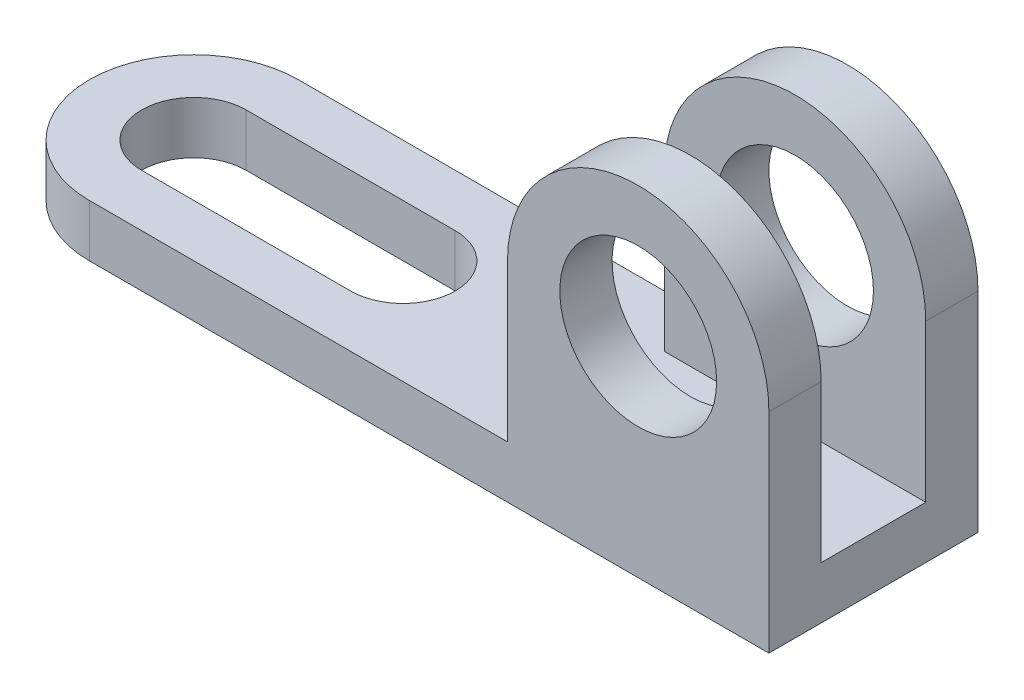
ISO-10303-21;
HEADER;
FILE_DESCRIPTION(('STEP AP214'),'2;1');
FILE_NAME('part.step','',(''),(''),'','','');
FILE_SCHEMA(('AUTOMOTIVE_DESIGN { 1 0 10303 214 1 1 1 1 }'));
ENDSEC;
DATA;
#1=APPLICATION_CONTEXT('core data for automotive mechanical design processes');
#2=APPLICATION_PROTOCOL_DEFINITION('international standard','automotive_design',2000,#1);
#3=PRODUCT_CONTEXT('',#1,'mechanical');
#4=PRODUCT('Part','Part','',(#3));
#5=PRODUCT_RELATED_PRODUCT_CATEGORY('part','',(#4));
#6=PRODUCT_DEFINITION_FORMATION('','',#4);
#7=PRODUCT_DEFINITION_CONTEXT('part definition',#1,'design');
#8=PRODUCT_DEFINITION('design','',#6,#7);
#9=PRODUCT_DEFINITION_SHAPE('','',#8);
#10=(LENGTH_UNIT() NAMED_UNIT(*) SI_UNIT(.MILLI.,.METRE.));
#11=(NAMED_UNIT(*) PLANE_ANGLE_UNIT() SI_UNIT($,.RADIAN.));
#12=(NAMED_UNIT(*) SI_UNIT($,.STERADIAN.) SOLID_ANGLE_UNIT());
#13=UNCERTAINTY_MEASURE_WITH_UNIT(LENGTH_MEASURE(1.E-05),#10,'distance_accuracy_value','');
#14=(GEOMETRIC_REPRESENTATION_CONTEXT(3) GLOBAL_UNCERTAINTY_ASSIGNED_CONTEXT((#13)) GLOBAL_UNIT_ASSIGNED_CONTEXT((#10,
#11,#12)) REPRESENTATION_CONTEXT('',''));
#15=CARTESIAN_POINT('',(0.,0.,0.));
#16=DIRECTION('',(0.,0.,1.));
#17=DIRECTION('',(1.,0.,0.));
#18=AXIS2_PLACEMENT_3D('',#15,#16,#17);
#19=CARTESIAN_POINT('',(65.,40.,-20.));
#20=DIRECTION('',(0.,0.,1.));
#21=DIRECTION('',(1.,0.,0.));
#22=AXIS2_PLACEMENT_3D('',#19,#20,#21);
#23=CYLINDRICAL_SURFACE('',#22,25.);
#24=CARTESIAN_POINT('',(65.,40.,10.));
#25=DIRECTION('',(0.,0.,1.));
#26=DIRECTION('',(0.,-1.,0.));
#27=AXIS2_PLACEMENT_3D('',#24,#25,#26);
#28=CIRCLE('',#27,25.);
#29=CARTESIAN_POINT('',(40.,40.,10.));
#30=VERTEX_POINT('',#29);
#31=CARTESIAN_POINT('',(90.,40.,10.));
#32=VERTEX_POINT('',#31);
#33=EDGE_CURVE('E250',#30,#32,#28,.F.);
#34=ORIENTED_EDGE('',*,*,#33,.F.);
#35=DIRECTION('',(0.,0.,1.));
#36=VECTOR('',#35,1.);
#37=CARTESIAN_POINT('',(40.,40.,-20.));
#38=LINE('',#37,#36);
#39=CARTESIAN_POINT('',(40.,40.,20.));
#40=VERTEX_POINT('',#39);
#41=EDGE_CURVE('E169',#30,#40,#38,.T.);
#42=ORIENTED_EDGE('',*,*,#41,.T.);
#43=CARTESIAN_POINT('',(65.,40.,20.));
#44=DIRECTION('',(0.,0.,1.));
#45=DIRECTION('',(1.,0.,0.));
#46=AXIS2_PLACEMENT_3D('',#43,#44,#45);
#47=CIRCLE('',#46,25.);
#48=CARTESIAN_POINT('',(90.,40.,20.));
#49=VERTEX_POINT('',#48);
#50=EDGE_CURVE('E256',#49,#40,#47,.T.);
#51=ORIENTED_EDGE('',*,*,#50,.F.);
#52=DIRECTION('',(0.,0.,1.));
#53=VECTOR('',#52,1.);
#54=CARTESIAN_POINT('',(90.,40.,-20.));
#55=LINE('',#54,#53);
#56=EDGE_CURVE('E179',#32,#49,#55,.T.);
#57=ORIENTED_EDGE('',*,*,#56,.F.);
#58=EDGE_LOOP('',(#34,#42,#51,#57));
#59=FACE_BOUND('',#58,.T.);
#60=ADVANCED_FACE('F48',(#59),#23,.T.);
#61=CARTESIAN_POINT('',(40.,9.99999999999999,-20.));
#62=DIRECTION('',(1.,0.,0.));
#63=DIRECTION('',(0.,0.,-1.));
#64=AXIS2_PLACEMENT_3D('',#61,#62,#63);
#65=PLANE('',#64);
#66=ORIENTED_EDGE('',*,*,#41,.F.);
#67=DIRECTION('',(0.,-1.,0.));
#68=VECTOR('',#67,1.);
#69=CARTESIAN_POINT('',(40.,65.,10.));
#70=LINE('',#69,#68);
#71=CARTESIAN_POINT('',(40.,9.99999999999999,10.));
#72=VERTEX_POINT('',#71);
#73=EDGE_CURVE('E154',#30,#72,#70,.T.);
#74=ORIENTED_EDGE('',*,*,#73,.T.);
#75=DIRECTION('',(0.,0.,1.));
#76=VECTOR('',#75,1.);
#77=CARTESIAN_POINT('',(40.,9.99999999999999,-20.));
#78=LINE('',#77,#76);
#79=CARTESIAN_POINT('',(40.,9.99999999999999,20.));
#80=VERTEX_POINT('',#79);
#81=EDGE_CURVE('E167',#72,#80,#78,.T.);
#82=ORIENTED_EDGE('',*,*,#81,.T.);
#83=DIRECTION('',(0.,1.,0.));
#84=VECTOR('',#83,1.);
#85=CARTESIAN_POINT('',(40.,9.99999999999999,20.));
#86=LINE('',#85,#84);
#87=EDGE_CURVE('E263',#80,#40,#86,.T.);
#88=ORIENTED_EDGE('',*,*,#87,.T.);
#89=EDGE_LOOP('',(#66,#74,#82,#88));
#90=FACE_BOUND('',#89,.T.);
#91=ADVANCED_FACE('F165',(#90),#65,.F.);
#92=CARTESIAN_POINT('',(65.,40.,-20.));
#93=DIRECTION('',(0.,0.,1.));
#94=DIRECTION('',(1.,0.,0.));
#95=AXIS2_PLACEMENT_3D('',#92,#93,#94);
#96=CYLINDRICAL_SURFACE('',#95,15.);
#97=CARTESIAN_POINT('',(65.,40.,10.));
#98=DIRECTION('',(0.,0.,1.));
#99=DIRECTION('',(0.,-1.,0.));
#100=AXIS2_PLACEMENT_3D('',#97,#98,#99);
#101=CIRCLE('',#100,15.);
#102=CARTESIAN_POINT('',(65.,25.,10.));
#103=VERTEX_POINT('',#102);
#104=EDGE_CURVE('E52',#103,#103,#101,.F.);
#105=ORIENTED_EDGE('',*,*,#104,.T.);
#106=EDGE_LOOP('',(#105));
#107=FACE_BOUND('',#106,.T.);
#108=CARTESIAN_POINT('',(65.,40.,20.));
#109=DIRECTION('',(0.,0.,1.));
#110=DIRECTION('',(1.,0.,0.));
#111=AXIS2_PLACEMENT_3D('',#108,#109,#110);
#112=CIRCLE('',#111,15.);
#113=CARTESIAN_POINT('',(80.,40.,20.));
#114=VERTEX_POINT('',#113);
#115=EDGE_CURVE('E252',#114,#114,#112,.T.);
#116=ORIENTED_EDGE('',*,*,#115,.T.);
#117=EDGE_LOOP('',(#116));
#118=FACE_BOUND('',#117,.T.);
#119=ADVANCED_FACE('F312',(#107,#118),#96,.F.);
#120=CARTESIAN_POINT('',(0.,10.,-20.));
#121=DIRECTION('',(0.,0.,-1.));
#122=DIRECTION('',(-1.,0.,0.));
#123=AXIS2_PLACEMENT_3D('',#120,#121,#122);
#124=PLANE('',#123);
#125=CARTESIAN_POINT('',(65.,40.,-20.));
#126=DIRECTION('',(0.,0.,1.));
#127=DIRECTION('',(1.,0.,0.));
#128=AXIS2_PLACEMENT_3D('',#125,#126,#127);
#129=CIRCLE('',#128,15.);
#130=CARTESIAN_POINT('',(80.,40.,-20.));
#131=VERTEX_POINT('',#130);
#132=EDGE_CURVE('E253',#131,#131,#129,.T.);
#133=ORIENTED_EDGE('',*,*,#132,.T.);
#134=EDGE_LOOP('',(#133));
#135=FACE_BOUND('',#134,.T.);
#136=DIRECTION('',(1.,0.,0.));
#137=VECTOR('',#136,1.);
#138=CARTESIAN_POINT('',(0.,0.,-20.));
#139=LINE('',#138,#137);
#140=CARTESIAN_POINT('',(-40.,0.,-20.));
#141=VERTEX_POINT('',#140);
#142=CARTESIAN_POINT('',(90.,0.,-20.));
#143=VERTEX_POINT('',#142);
#144=EDGE_CURVE('E216',#141,#143,#139,.T.);
#145=ORIENTED_EDGE('',*,*,#144,.F.);
#146=DIRECTION('',(0.,-1.,0.));
#147=VECTOR('',#146,1.);
#148=CARTESIAN_POINT('',(-40.,10.,-20.));
#149=LINE('',#148,#147);
#150=CARTESIAN_POINT('',(-40.,10.,-20.));
#151=VERTEX_POINT('',#150);
#152=EDGE_CURVE('E13',#151,#141,#149,.T.);
#153=ORIENTED_EDGE('',*,*,#152,.F.);
#154=DIRECTION('',(1.,0.,0.));
#155=VECTOR('',#154,1.);
#156=CARTESIAN_POINT('',(0.,10.,-20.));
#157=LINE('',#156,#155);
#158=CARTESIAN_POINT('',(40.,10.,-20.));
#159=VERTEX_POINT('',#158);
#160=EDGE_CURVE('E198',#151,#159,#157,.T.);
#161=ORIENTED_EDGE('',*,*,#160,.T.);
#162=DIRECTION('',(0.,1.,0.));
#163=VECTOR('',#162,1.);
#164=CARTESIAN_POINT('',(40.,9.99999999999999,-20.));
#165=LINE('',#164,#163);
#166=CARTESIAN_POINT('',(40.,40.,-20.));
#167=VERTEX_POINT('',#166);
#168=EDGE_CURVE('E262',#159,#167,#165,.T.);
#169=ORIENTED_EDGE('',*,*,#168,.T.);
#170=CARTESIAN_POINT('',(65.,40.,-20.));
#171=DIRECTION('',(0.,0.,1.));
#172=DIRECTION('',(1.,0.,0.));
#173=AXIS2_PLACEMENT_3D('',#170,#171,#172);
#174=CIRCLE('',#173,25.);
#175=CARTESIAN_POINT('',(90.,40.,-20.));
#176=VERTEX_POINT('',#175);
#177=EDGE_CURVE('E259',#176,#167,#174,.T.);
#178=ORIENTED_EDGE('',*,*,#177,.F.);
#179=DIRECTION('',(0.,-1.,0.));
#180=VECTOR('',#179,1.);
#181=CARTESIAN_POINT('',(90.,10.,-20.));
#182=LINE('',#181,#180);
#183=EDGE_CURVE('E227',#176,#143,#182,.T.);
#184=ORIENTED_EDGE('',*,*,#183,.T.);
#185=EDGE_LOOP('',(#145,#153,#161,#169,#178,#184));
#186=FACE_BOUND('',#185,.T.);
#187=ADVANCED_FACE('F289',(#135,#186),#124,.T.);
#188=CARTESIAN_POINT('',(-40.,10.,0.));
#189=DIRECTION('',(0.,-1.,0.));
#190=DIRECTION('',(0.,0.,-1.));
#191=AXIS2_PLACEMENT_3D('',#188,#189,#190);
#192=CYLINDRICAL_SURFACE('',#191,20.);
#193=CARTESIAN_POINT('',(-40.,0.,0.));
#194=DIRECTION('',(0.,1.,0.));
#195=DIRECTION('',(0.,0.,1.));
#196=AXIS2_PLACEMENT_3D('',#193,#194,#195);
#197=CIRCLE('',#196,20.);
#198=CARTESIAN_POINT('',(-40.,0.,20.));
#199=VERTEX_POINT('',#198);
#200=EDGE_CURVE('E219',#141,#199,#197,.T.);
#201=ORIENTED_EDGE('',*,*,#200,.T.);
#202=DIRECTION('',(0.,-1.,0.));
#203=VECTOR('',#202,1.);
#204=CARTESIAN_POINT('',(-40.,10.,20.));
#205=LINE('',#204,#203);
#206=CARTESIAN_POINT('',(-40.,10.,20.));
#207=VERTEX_POINT('',#206);
#208=EDGE_CURVE('E57',#207,#199,#205,.T.);
#209=ORIENTED_EDGE('',*,*,#208,.F.);
#210=CARTESIAN_POINT('',(-40.,10.,0.));
#211=DIRECTION('',(0.,1.,0.));
#212=DIRECTION('',(0.,0.,1.));
#213=AXIS2_PLACEMENT_3D('',#210,#211,#212);
#214=CIRCLE('',#213,20.);
#215=EDGE_CURVE('E200',#151,#207,#214,.T.);
#216=ORIENTED_EDGE('',*,*,#215,.F.);
#217=ORIENTED_EDGE('',*,*,#152,.T.);
#218=EDGE_LOOP('',(#201,#209,#216,#217));
#219=FACE_BOUND('',#218,.T.);
#220=ADVANCED_FACE('F293',(#219),#192,.T.);
#221=CARTESIAN_POINT('',(0.,10.,20.));
#222=DIRECTION('',(0.,0.,-1.));
#223=DIRECTION('',(-1.,0.,0.));
#224=AXIS2_PLACEMENT_3D('',#221,#222,#223);
#225=PLANE('',#224);
#226=ORIENTED_EDGE('',*,*,#115,.F.);
#227=EDGE_LOOP('',(#226));
#228=FACE_BOUND('',#227,.T.);
#229=DIRECTION('',(1.,0.,0.));
#230=VECTOR('',#229,1.);
#231=CARTESIAN_POINT('',(0.,0.,20.));
#232=LINE('',#231,#230);
#233=CARTESIAN_POINT('',(90.,0.,20.));
#234=VERTEX_POINT('',#233);
#235=EDGE_CURVE('E222',#199,#234,#232,.T.);
#236=ORIENTED_EDGE('',*,*,#235,.T.);
#237=DIRECTION('',(0.,-1.,0.));
#238=VECTOR('',#237,1.);
#239=CARTESIAN_POINT('',(90.,10.,20.));
#240=LINE('',#239,#238);
#241=EDGE_CURVE('E229',#49,#234,#240,.T.);
#242=ORIENTED_EDGE('',*,*,#241,.F.);
#243=ORIENTED_EDGE('',*,*,#50,.T.);
#244=ORIENTED_EDGE('',*,*,#87,.F.);
#245=DIRECTION('',(1.,0.,0.));
#246=VECTOR('',#245,1.);
#247=CARTESIAN_POINT('',(0.,10.,20.));
#248=LINE('',#247,#246);
#249=EDGE_CURVE('E175',#207,#80,#248,.T.);
#250=ORIENTED_EDGE('',*,*,#249,.F.);
#251=ORIENTED_EDGE('',*,*,#208,.T.);
#252=EDGE_LOOP('',(#236,#242,#243,#244,#250,#251));
#253=FACE_BOUND('',#252,.T.);
#254=ADVANCED_FACE('F269',(#228,#253),#225,.F.);
#255=CARTESIAN_POINT('',(0.,10.,0.));
#256=DIRECTION('',(0.,-1.,0.));
#257=DIRECTION('',(0.,0.,-1.));
#258=AXIS2_PLACEMENT_3D('',#255,#256,#257);
#259=CYLINDRICAL_SURFACE('',#258,10.);
#260=CARTESIAN_POINT('',(0.,0.,0.));
#261=DIRECTION('',(0.,1.,0.));
#262=DIRECTION('',(0.,0.,1.));
#263=AXIS2_PLACEMENT_3D('',#260,#261,#262);
#264=CIRCLE('',#263,10.);
#265=CARTESIAN_POINT('',(0.,0.,10.));
#266=VERTEX_POINT('',#265);
#267=CARTESIAN_POINT('',(0.,0.,-10.));
#268=VERTEX_POINT('',#267);
#269=EDGE_CURVE('E204',#266,#268,#264,.T.);
#270=ORIENTED_EDGE('',*,*,#269,.F.);
#271=DIRECTION('',(0.,-1.,0.));
#272=VECTOR('',#271,1.);
#273=CARTESIAN_POINT('',(0.,10.,10.));
#274=LINE('',#273,#272);
#275=CARTESIAN_POINT('',(0.,10.,10.));
#276=VERTEX_POINT('',#275);
#277=EDGE_CURVE('E230',#276,#266,#274,.T.);
#278=ORIENTED_EDGE('',*,*,#277,.F.);
#279=CARTESIAN_POINT('',(0.,10.,0.));
#280=DIRECTION('',(0.,1.,0.));
#281=DIRECTION('',(0.,0.,1.));
#282=AXIS2_PLACEMENT_3D('',#279,#280,#281);
#283=CIRCLE('',#282,10.);
#284=CARTESIAN_POINT('',(0.,10.,-10.));
#285=VERTEX_POINT('',#284);
#286=EDGE_CURVE('E186',#276,#285,#283,.T.);
#287=ORIENTED_EDGE('',*,*,#286,.T.);
#288=DIRECTION('',(0.,-1.,0.));
#289=VECTOR('',#288,1.);
#290=CARTESIAN_POINT('',(0.,10.,-10.));
#291=LINE('',#290,#289);
#292=EDGE_CURVE('E203',#285,#268,#291,.T.);
#293=ORIENTED_EDGE('',*,*,#292,.T.);
#294=EDGE_LOOP('',(#270,#278,#287,#293));
#295=FACE_BOUND('',#294,.T.);
#296=ADVANCED_FACE('F50',(#295),#259,.F.);
#297=CARTESIAN_POINT('',(0.,10.,10.));
#298=DIRECTION('',(0.,0.,-1.));
#299=DIRECTION('',(-1.,0.,0.));
#300=AXIS2_PLACEMENT_3D('',#297,#298,#299);
#301=PLANE('',#300);
#302=DIRECTION('',(1.,0.,0.));
#303=VECTOR('',#302,1.);
#304=CARTESIAN_POINT('',(0.,0.,10.));
#305=LINE('',#304,#303);
#306=CARTESIAN_POINT('',(-40.,0.,10.));
#307=VERTEX_POINT('',#306);
#308=EDGE_CURVE('E207',#307,#266,#305,.T.);
#309=ORIENTED_EDGE('',*,*,#308,.F.);
#310=DIRECTION('',(0.,-1.,0.));
#311=VECTOR('',#310,1.);
#312=CARTESIAN_POINT('',(-40.,10.,10.));
#313=LINE('',#312,#311);
#314=CARTESIAN_POINT('',(-40.,10.,10.));
#315=VERTEX_POINT('',#314);
#316=EDGE_CURVE('E237',#315,#307,#313,.T.);
#317=ORIENTED_EDGE('',*,*,#316,.F.);
#318=DIRECTION('',(1.,0.,0.));
#319=VECTOR('',#318,1.);
#320=CARTESIAN_POINT('',(0.,10.,10.));
#321=LINE('',#320,#319);
#322=EDGE_CURVE('E189',#315,#276,#321,.T.);
#323=ORIENTED_EDGE('',*,*,#322,.T.);
#324=ORIENTED_EDGE('',*,*,#277,.T.);
#325=EDGE_LOOP('',(#309,#317,#323,#324));
#326=FACE_BOUND('',#325,.T.);
#327=ADVANCED_FACE('F342',(#326),#301,.T.);
#328=CARTESIAN_POINT('',(-40.,10.,0.));
#329=DIRECTION('',(0.,-1.,0.));
#330=DIRECTION('',(0.,0.,-1.));
#331=AXIS2_PLACEMENT_3D('',#328,#329,#330);
#332=CYLINDRICAL_SURFACE('',#331,10.);
#333=CARTESIAN_POINT('',(-40.,0.,0.));
#334=DIRECTION('',(0.,1.,0.));
#335=DIRECTION('',(0.,0.,1.));
#336=AXIS2_PLACEMENT_3D('',#333,#334,#335);
#337=CIRCLE('',#336,10.);
#338=CARTESIAN_POINT('',(-40.,0.,-10.));
#339=VERTEX_POINT('',#338);
#340=EDGE_CURVE('E210',#339,#307,#337,.T.);
#341=ORIENTED_EDGE('',*,*,#340,.F.);
#342=DIRECTION('',(0.,-1.,0.));
#343=VECTOR('',#342,1.);
#344=CARTESIAN_POINT('',(-40.,10.,-10.));
#345=LINE('',#344,#343);
#346=CARTESIAN_POINT('',(-40.,10.,-10.));
#347=VERTEX_POINT('',#346);
#348=EDGE_CURVE('E235',#347,#339,#345,.T.);
#349=ORIENTED_EDGE('',*,*,#348,.F.);
#350=CARTESIAN_POINT('',(-40.,10.,0.));
#351=DIRECTION('',(0.,1.,0.));
#352=DIRECTION('',(0.,0.,1.));
#353=AXIS2_PLACEMENT_3D('',#350,#351,#352);
#354=CIRCLE('',#353,10.);
#355=EDGE_CURVE('E193',#347,#315,#354,.T.);
#356=ORIENTED_EDGE('',*,*,#355,.T.);
#357=ORIENTED_EDGE('',*,*,#316,.T.);
#358=EDGE_LOOP('',(#341,#349,#356,#357));
#359=FACE_BOUND('',#358,.T.);
#360=ADVANCED_FACE('F339',(#359),#332,.F.);
#361=CARTESIAN_POINT('',(0.,10.,-10.));
#362=DIRECTION('',(0.,0.,-1.));
#363=DIRECTION('',(-1.,0.,0.));
#364=AXIS2_PLACEMENT_3D('',#361,#362,#363);
#365=PLANE('',#364);
#366=DIRECTION('',(1.,0.,0.));
#367=VECTOR('',#366,1.);
#368=CARTESIAN_POINT('',(0.,0.,-10.));
#369=LINE('',#368,#367);
#370=EDGE_CURVE('E213',#339,#268,#369,.T.);
#371=ORIENTED_EDGE('',*,*,#370,.T.);
#372=ORIENTED_EDGE('',*,*,#292,.F.);
#373=DIRECTION('',(1.,0.,0.));
#374=VECTOR('',#373,1.);
#375=CARTESIAN_POINT('',(0.,10.,-10.));
#376=LINE('',#375,#374);
#377=EDGE_CURVE('E196',#347,#285,#376,.T.);
#378=ORIENTED_EDGE('',*,*,#377,.F.);
#379=ORIENTED_EDGE('',*,*,#348,.T.);
#380=EDGE_LOOP('',(#371,#372,#378,#379));
#381=FACE_BOUND('',#380,.T.);
#382=ADVANCED_FACE('F328',(#381),#365,.F.);
#383=CARTESIAN_POINT('',(90.,10.,0.));
#384=DIRECTION('',(1.,0.,0.));
#385=DIRECTION('',(0.,0.,-1.));
#386=AXIS2_PLACEMENT_3D('',#383,#384,#385);
#387=PLANE('',#386);
#388=DIRECTION('',(0.,-1.,0.));
#389=VECTOR('',#388,1.);
#390=CARTESIAN_POINT('',(90.,65.,10.));
#391=LINE('',#390,#389);
#392=CARTESIAN_POINT('',(90.,9.99999999999999,10.));
#393=VERTEX_POINT('',#392);
#394=EDGE_CURVE('E157',#32,#393,#391,.T.);
#395=ORIENTED_EDGE('',*,*,#394,.F.);
#396=ORIENTED_EDGE('',*,*,#56,.T.);
#397=ORIENTED_EDGE('',*,*,#241,.T.);
#398=DIRECTION('',(0.,0.,1.));
#399=VECTOR('',#398,1.);
#400=CARTESIAN_POINT('',(90.,0.,0.));
#401=LINE('',#400,#399);
#402=EDGE_CURVE('E190',#143,#234,#401,.T.);
#403=ORIENTED_EDGE('',*,*,#402,.F.);
#404=ORIENTED_EDGE('',*,*,#183,.F.);
#405=CARTESIAN_POINT('',(90.,40.,-10.));
#406=VERTEX_POINT('',#405);
#407=EDGE_CURVE('E183',#176,#406,#55,.T.);
#408=ORIENTED_EDGE('',*,*,#407,.T.);
#409=DIRECTION('',(0.,1.,0.));
#410=VECTOR('',#409,1.);
#411=CARTESIAN_POINT('',(90.,65.,-9.99999999999999));
#412=LINE('',#411,#410);
#413=CARTESIAN_POINT('',(90.,9.99999999999999,-10.));
#414=VERTEX_POINT('',#413);
#415=EDGE_CURVE('E170',#414,#406,#412,.T.);
#416=ORIENTED_EDGE('',*,*,#415,.F.);
#417=DIRECTION('',(0.,0.,-1.));
#418=VECTOR('',#417,1.);
#419=CARTESIAN_POINT('',(90.,9.99999999999999,10.));
#420=LINE('',#419,#418);
#421=EDGE_CURVE('E275',#393,#414,#420,.T.);
#422=ORIENTED_EDGE('',*,*,#421,.F.);
#423=EDGE_LOOP('',(#395,#396,#397,#403,#404,#408,#416,#422));
#424=FACE_BOUND('',#423,.T.);
#425=ADVANCED_FACE('F273',(#424),#387,.T.);
#426=CARTESIAN_POINT('',(0.,10.,0.));
#427=DIRECTION('',(0.,1.,0.));
#428=DIRECTION('',(0.,0.,1.));
#429=AXIS2_PLACEMENT_3D('',#426,#427,#428);
#430=PLANE('',#429);
#431=CARTESIAN_POINT('',(40.,9.99999999999999,-10.));
#432=VERTEX_POINT('',#431);
#433=EDGE_CURVE('E72',#159,#432,#78,.T.);
#434=ORIENTED_EDGE('',*,*,#433,.F.);
#435=ORIENTED_EDGE('',*,*,#160,.F.);
#436=ORIENTED_EDGE('',*,*,#215,.T.);
#437=ORIENTED_EDGE('',*,*,#249,.T.);
#438=ORIENTED_EDGE('',*,*,#81,.F.);
#439=DIRECTION('',(1.,0.,0.));
#440=VECTOR('',#439,1.);
#441=CARTESIAN_POINT('',(40.,9.99999999999999,10.));
#442=LINE('',#441,#440);
#443=EDGE_CURVE('E150',#72,#393,#442,.T.);
#444=ORIENTED_EDGE('',*,*,#443,.T.);
#445=ORIENTED_EDGE('',*,*,#421,.T.);
#446=DIRECTION('',(1.,0.,0.));
#447=VECTOR('',#446,1.);
#448=CARTESIAN_POINT('',(40.,9.99999999999999,-10.));
#449=LINE('',#448,#447);
#450=EDGE_CURVE('E161',#432,#414,#449,.T.);
#451=ORIENTED_EDGE('',*,*,#450,.F.);
#452=EDGE_LOOP('',(#434,#435,#436,#437,#438,#444,#445,#451));
#453=FACE_BOUND('',#452,.T.);
#454=ORIENTED_EDGE('',*,*,#286,.F.);
#455=ORIENTED_EDGE('',*,*,#322,.F.);
#456=ORIENTED_EDGE('',*,*,#355,.F.);
#457=ORIENTED_EDGE('',*,*,#377,.T.);
#458=EDGE_LOOP('',(#454,#455,#456,#457));
#459=FACE_BOUND('',#458,.T.);
#460=ADVANCED_FACE('F172',(#453,#459),#430,.T.);
#461=CARTESIAN_POINT('',(0.,0.,0.));
#462=DIRECTION('',(0.,1.,0.));
#463=DIRECTION('',(0.,0.,1.));
#464=AXIS2_PLACEMENT_3D('',#461,#462,#463);
#465=PLANE('',#464);
#466=ORIENTED_EDGE('',*,*,#269,.T.);
#467=ORIENTED_EDGE('',*,*,#370,.F.);
#468=ORIENTED_EDGE('',*,*,#340,.T.);
#469=ORIENTED_EDGE('',*,*,#308,.T.);
#470=EDGE_LOOP('',(#466,#467,#468,#469));
#471=FACE_BOUND('',#470,.T.);
#472=ORIENTED_EDGE('',*,*,#144,.T.);
#473=ORIENTED_EDGE('',*,*,#402,.T.);
#474=ORIENTED_EDGE('',*,*,#235,.F.);
#475=ORIENTED_EDGE('',*,*,#200,.F.);
#476=EDGE_LOOP('',(#472,#473,#474,#475));
#477=FACE_BOUND('',#476,.T.);
#478=ADVANCED_FACE('F297',(#471,#477),#465,.F.);
#479=CARTESIAN_POINT('',(65.,40.,-10.));
#480=DIRECTION('',(0.,0.,-1.));
#481=DIRECTION('',(0.,1.,0.));
#482=AXIS2_PLACEMENT_3D('',#479,#480,#481);
#483=CIRCLE('',#482,25.);
#484=CARTESIAN_POINT('',(40.,40.,-10.));
#485=VERTEX_POINT('',#484);
#486=EDGE_CURVE('E241',#406,#485,#483,.F.);
#487=ORIENTED_EDGE('',*,*,#486,.F.);
#488=ORIENTED_EDGE('',*,*,#407,.F.);
#489=ORIENTED_EDGE('',*,*,#177,.T.);
#490=EDGE_CURVE('E177',#167,#485,#38,.T.);
#491=ORIENTED_EDGE('',*,*,#490,.T.);
#492=EDGE_LOOP('',(#487,#488,#489,#491));
#493=FACE_BOUND('',#492,.T.);
#494=ADVANCED_FACE('F283',(#493),#23,.T.);
#495=ORIENTED_EDGE('',*,*,#433,.T.);
#496=DIRECTION('',(0.,1.,0.));
#497=VECTOR('',#496,1.);
#498=CARTESIAN_POINT('',(40.,65.,-9.99999999999999));
#499=LINE('',#498,#497);
#500=EDGE_CURVE('E65',#432,#485,#499,.T.);
#501=ORIENTED_EDGE('',*,*,#500,.T.);
#502=ORIENTED_EDGE('',*,*,#490,.F.);
#503=ORIENTED_EDGE('',*,*,#168,.F.);
#504=EDGE_LOOP('',(#495,#501,#502,#503));
#505=FACE_BOUND('',#504,.T.);
#506=ADVANCED_FACE('F280',(#505),#65,.F.);
#507=CARTESIAN_POINT('',(65.,40.,-10.));
#508=DIRECTION('',(0.,0.,-1.));
#509=DIRECTION('',(0.,1.,0.));
#510=AXIS2_PLACEMENT_3D('',#507,#508,#509);
#511=CIRCLE('',#510,15.);
#512=CARTESIAN_POINT('',(65.,55.,-10.));
#513=VERTEX_POINT('',#512);
#514=EDGE_CURVE('E239',#513,#513,#511,.F.);
#515=ORIENTED_EDGE('',*,*,#514,.T.);
#516=EDGE_LOOP('',(#515));
#517=FACE_BOUND('',#516,.T.);
#518=ORIENTED_EDGE('',*,*,#132,.F.);
#519=EDGE_LOOP('',(#518));
#520=FACE_BOUND('',#519,.T.);
#521=ADVANCED_FACE('F305',(#517,#520),#96,.F.);
#522=CARTESIAN_POINT('',(40.,65.,10.));
#523=DIRECTION('',(0.,0.,1.));
#524=DIRECTION('',(0.,-1.,0.));
#525=AXIS2_PLACEMENT_3D('',#522,#523,#524);
#526=PLANE('',#525);
#527=ORIENTED_EDGE('',*,*,#33,.T.);
#528=ORIENTED_EDGE('',*,*,#394,.T.);
#529=ORIENTED_EDGE('',*,*,#443,.F.);
#530=ORIENTED_EDGE('',*,*,#73,.F.);
#531=EDGE_LOOP('',(#527,#528,#529,#530));
#532=FACE_BOUND('',#531,.T.);
#533=ORIENTED_EDGE('',*,*,#104,.F.);
#534=EDGE_LOOP('',(#533));
#535=FACE_BOUND('',#534,.T.);
#536=ADVANCED_FACE('F152',(#532,#535),#526,.F.);
#537=CARTESIAN_POINT('',(40.,65.,-9.99999999999999));
#538=DIRECTION('',(0.,0.,-1.));
#539=DIRECTION('',(0.,1.,0.));
#540=AXIS2_PLACEMENT_3D('',#537,#538,#539);
#541=PLANE('',#540);
#542=ORIENTED_EDGE('',*,*,#486,.T.);
#543=ORIENTED_EDGE('',*,*,#500,.F.);
#544=ORIENTED_EDGE('',*,*,#450,.T.);
#545=ORIENTED_EDGE('',*,*,#415,.T.);
#546=EDGE_LOOP('',(#542,#543,#544,#545));
#547=FACE_BOUND('',#546,.T.);
#548=ORIENTED_EDGE('',*,*,#514,.F.);
#549=EDGE_LOOP('',(#548));
#550=FACE_BOUND('',#549,.T.);
#551=ADVANCED_FACE('F298',(#547,#550),#541,.F.);
#552=CLOSED_SHELL('',(#60,#91,#119,#187,#220,#254,#296,#327,#360,#382,#425,#460,#478,#494,#506,
#521,#536,#551));
#553=MANIFOLD_SOLID_BREP('B2',#552);
#554=ADVANCED_BREP_SHAPE_REPRESENTATION('',(#18,#553),#14);
#555=SHAPE_DEFINITION_REPRESENTATION(#9,#554);
ENDSEC;
END-ISO-10303-21;
